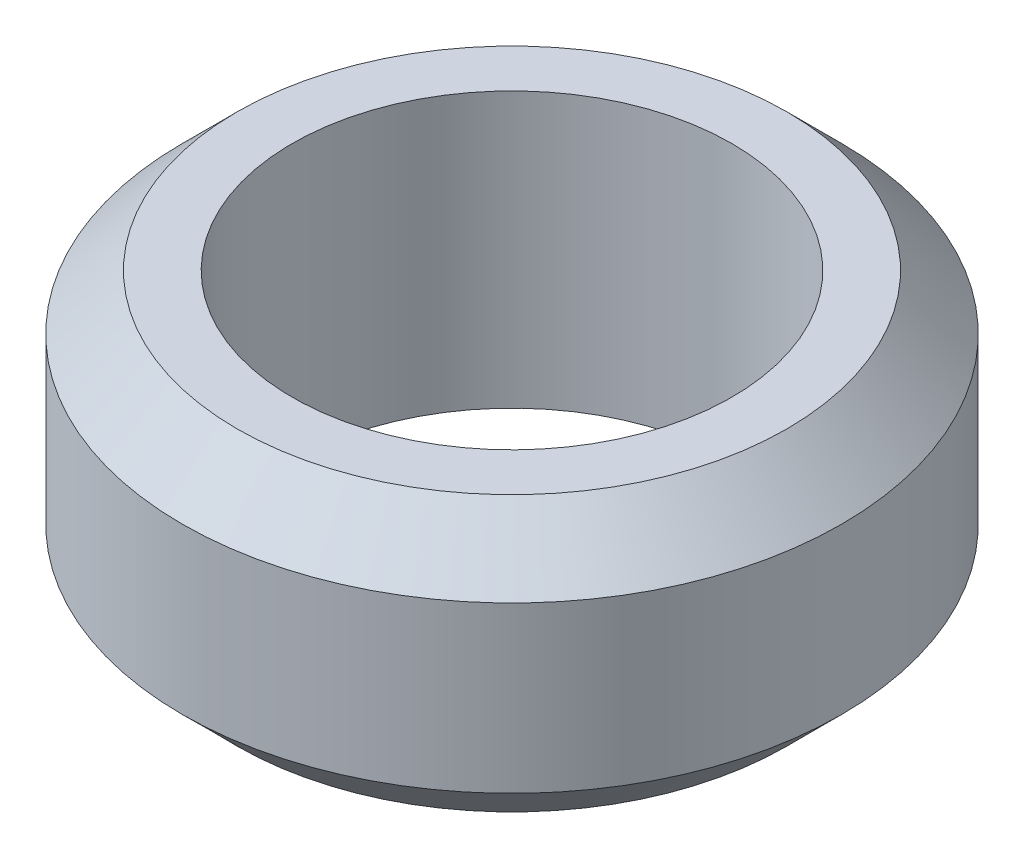
ISO-10303-21;
HEADER;
FILE_DESCRIPTION(('STEP AP214'),'2;1');
FILE_NAME('part.step','',(''),(''),'','','');
FILE_SCHEMA(('AUTOMOTIVE_DESIGN { 1 0 10303 214 1 1 1 1 }'));
ENDSEC;
DATA;
#1=APPLICATION_CONTEXT('core data for automotive mechanical design processes');
#2=APPLICATION_PROTOCOL_DEFINITION('international standard','automotive_design',2000,#1);
#3=PRODUCT_CONTEXT('',#1,'mechanical');
#4=PRODUCT('Part','Part','',(#3));
#5=PRODUCT_RELATED_PRODUCT_CATEGORY('part','',(#4));
#6=PRODUCT_DEFINITION_FORMATION('','',#4);
#7=PRODUCT_DEFINITION_CONTEXT('part definition',#1,'design');
#8=PRODUCT_DEFINITION('design','',#6,#7);
#9=PRODUCT_DEFINITION_SHAPE('','',#8);
#10=(LENGTH_UNIT() NAMED_UNIT(*) SI_UNIT(.MILLI.,.METRE.));
#11=(NAMED_UNIT(*) PLANE_ANGLE_UNIT() SI_UNIT($,.RADIAN.));
#12=(NAMED_UNIT(*) SI_UNIT($,.STERADIAN.) SOLID_ANGLE_UNIT());
#13=UNCERTAINTY_MEASURE_WITH_UNIT(LENGTH_MEASURE(1.E-05),#10,'distance_accuracy_value','');
#14=(GEOMETRIC_REPRESENTATION_CONTEXT(3) GLOBAL_UNCERTAINTY_ASSIGNED_CONTEXT((#13)) GLOBAL_UNIT_ASSIGNED_CONTEXT((#10,
#11,#12)) REPRESENTATION_CONTEXT('',''));
#15=CARTESIAN_POINT('',(0.,0.,0.));
#16=DIRECTION('',(0.,0.,1.));
#17=DIRECTION('',(1.,0.,0.));
#18=AXIS2_PLACEMENT_3D('',#15,#16,#17);
#19=CARTESIAN_POINT('',(0.,5.,0.));
#20=DIRECTION('',(0.,-1.,0.));
#21=DIRECTION('',(0.,0.,-1.));
#22=AXIS2_PLACEMENT_3D('',#19,#20,#21);
#23=CONICAL_SURFACE('',#22,10.,0.785398163397447);
#24=CARTESIAN_POINT('',(0.,2.99999999999999,0.));
#25=DIRECTION('',(0.,-1.,0.));
#26=DIRECTION('',(0.,0.,-1.));
#27=AXIS2_PLACEMENT_3D('',#24,#25,#26);
#28=CIRCLE('',#27,12.);
#29=CARTESIAN_POINT('',(0.,2.99999999999999,-12.));
#30=VERTEX_POINT('',#29);
#31=EDGE_CURVE('E55',#30,#30,#28,.T.);
#32=ORIENTED_EDGE('',*,*,#31,.F.);
#33=EDGE_LOOP('',(#32));
#34=FACE_BOUND('',#33,.T.);
#35=CARTESIAN_POINT('',(0.,5.,0.));
#36=DIRECTION('',(0.,-1.,0.));
#37=DIRECTION('',(0.,0.,-1.));
#38=AXIS2_PLACEMENT_3D('',#35,#36,#37);
#39=CIRCLE('',#38,10.);
#40=CARTESIAN_POINT('',(0.,5.,-10.));
#41=VERTEX_POINT('',#40);
#42=EDGE_CURVE('E10',#41,#41,#39,.T.);
#43=ORIENTED_EDGE('',*,*,#42,.T.);
#44=EDGE_LOOP('',(#43));
#45=FACE_BOUND('',#44,.T.);
#46=ADVANCED_FACE('F43',(#34,#45),#23,.T.);
#47=CARTESIAN_POINT('',(0.,5.,0.));
#48=DIRECTION('',(0.,-1.,0.));
#49=DIRECTION('',(0.,0.,-1.));
#50=AXIS2_PLACEMENT_3D('',#47,#48,#49);
#51=PLANE('',#50);
#52=ORIENTED_EDGE('',*,*,#42,.F.);
#53=EDGE_LOOP('',(#52));
#54=FACE_BOUND('',#53,.T.);
#55=CARTESIAN_POINT('',(0.,5.,0.));
#56=DIRECTION('',(0.,-1.,0.));
#57=DIRECTION('',(0.,0.,-1.));
#58=AXIS2_PLACEMENT_3D('',#55,#56,#57);
#59=CIRCLE('',#58,8.);
#60=CARTESIAN_POINT('',(0.,5.,-8.));
#61=VERTEX_POINT('',#60);
#62=EDGE_CURVE('E50',#61,#61,#59,.T.);
#63=ORIENTED_EDGE('',*,*,#62,.T.);
#64=EDGE_LOOP('',(#63));
#65=FACE_BOUND('',#64,.T.);
#66=ADVANCED_FACE('F89',(#54,#65),#51,.F.);
#67=CARTESIAN_POINT('',(0.,0.,0.));
#68=DIRECTION('',(0.,-1.,0.));
#69=DIRECTION('',(0.,0.,-1.));
#70=AXIS2_PLACEMENT_3D('',#67,#68,#69);
#71=CYLINDRICAL_SURFACE('',#70,8.);
#72=ORIENTED_EDGE('',*,*,#62,.F.);
#73=EDGE_LOOP('',(#72));
#74=FACE_BOUND('',#73,.T.);
#75=CARTESIAN_POINT('',(0.,-5.,0.));
#76=DIRECTION('',(0.,-1.,0.));
#77=DIRECTION('',(0.,0.,-1.));
#78=AXIS2_PLACEMENT_3D('',#75,#76,#77);
#79=CIRCLE('',#78,8.);
#80=CARTESIAN_POINT('',(0.,-5.,-8.));
#81=VERTEX_POINT('',#80);
#82=EDGE_CURVE('E66',#81,#81,#79,.T.);
#83=ORIENTED_EDGE('',*,*,#82,.T.);
#84=EDGE_LOOP('',(#83));
#85=FACE_BOUND('',#84,.T.);
#86=ADVANCED_FACE('F80',(#74,#85),#71,.F.);
#87=CARTESIAN_POINT('',(0.,0.,0.));
#88=DIRECTION('',(0.,-1.,0.));
#89=DIRECTION('',(0.,0.,-1.));
#90=AXIS2_PLACEMENT_3D('',#87,#88,#89);
#91=CYLINDRICAL_SURFACE('',#90,12.);
#92=ORIENTED_EDGE('',*,*,#31,.T.);
#93=EDGE_LOOP('',(#92));
#94=FACE_BOUND('',#93,.T.);
#95=CARTESIAN_POINT('',(0.,-2.99999999999999,0.));
#96=DIRECTION('',(0.,-1.,0.));
#97=DIRECTION('',(0.,0.,-1.));
#98=AXIS2_PLACEMENT_3D('',#95,#96,#97);
#99=CIRCLE('',#98,12.);
#100=CARTESIAN_POINT('',(0.,-2.99999999999999,-12.));
#101=VERTEX_POINT('',#100);
#102=EDGE_CURVE('E70',#101,#101,#99,.T.);
#103=ORIENTED_EDGE('',*,*,#102,.F.);
#104=EDGE_LOOP('',(#103));
#105=FACE_BOUND('',#104,.T.);
#106=ADVANCED_FACE('F78',(#94,#105),#91,.T.);
#107=CARTESIAN_POINT('',(0.,-5.,0.));
#108=DIRECTION('',(0.,1.,0.));
#109=DIRECTION('',(0.,0.,-1.));
#110=AXIS2_PLACEMENT_3D('',#107,#108,#109);
#111=CONICAL_SURFACE('',#110,10.,0.785398163397447);
#112=ORIENTED_EDGE('',*,*,#102,.T.);
#113=EDGE_LOOP('',(#112));
#114=FACE_BOUND('',#113,.T.);
#115=CARTESIAN_POINT('',(0.,-5.,0.));
#116=DIRECTION('',(0.,-1.,0.));
#117=DIRECTION('',(0.,0.,-1.));
#118=AXIS2_PLACEMENT_3D('',#115,#116,#117);
#119=CIRCLE('',#118,10.);
#120=CARTESIAN_POINT('',(0.,-5.,-10.));
#121=VERTEX_POINT('',#120);
#122=EDGE_CURVE('E60',#121,#121,#119,.T.);
#123=ORIENTED_EDGE('',*,*,#122,.F.);
#124=EDGE_LOOP('',(#123));
#125=FACE_BOUND('',#124,.T.);
#126=ADVANCED_FACE('F75',(#114,#125),#111,.T.);
#127=CARTESIAN_POINT('',(0.,-5.,0.));
#128=DIRECTION('',(0.,1.,0.));
#129=DIRECTION('',(0.,0.,-1.));
#130=AXIS2_PLACEMENT_3D('',#127,#128,#129);
#131=PLANE('',#130);
#132=ORIENTED_EDGE('',*,*,#122,.T.);
#133=EDGE_LOOP('',(#132));
#134=FACE_BOUND('',#133,.T.);
#135=ORIENTED_EDGE('',*,*,#82,.F.);
#136=EDGE_LOOP('',(#135));
#137=FACE_BOUND('',#136,.T.);
#138=ADVANCED_FACE('F87',(#134,#137),#131,.F.);
#139=CLOSED_SHELL('',(#46,#66,#86,#106,#126,#138));
#140=MANIFOLD_SOLID_BREP('B2',#139);
#141=ADVANCED_BREP_SHAPE_REPRESENTATION('',(#18,#140),#14);
#142=SHAPE_DEFINITION_REPRESENTATION(#9,#141);
ENDSEC;
END-ISO-10303-21;
